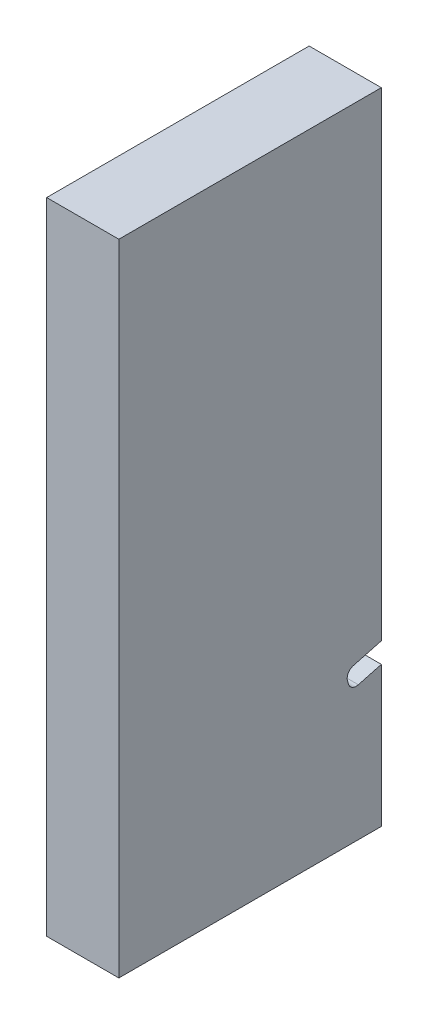
ISO-10303-21;
HEADER;
FILE_DESCRIPTION(('STEP AP214'),'2;1');
FILE_NAME('part.step','',(''),(''),'','','');
FILE_SCHEMA(('AUTOMOTIVE_DESIGN { 1 0 10303 214 1 1 1 1 }'));
ENDSEC;
DATA;
#1=APPLICATION_CONTEXT('core data for automotive mechanical design processes');
#2=APPLICATION_PROTOCOL_DEFINITION('international standard','automotive_design',2000,#1);
#3=PRODUCT_CONTEXT('',#1,'mechanical');
#4=PRODUCT('Part','Part','',(#3));
#5=PRODUCT_RELATED_PRODUCT_CATEGORY('part','',(#4));
#6=PRODUCT_DEFINITION_FORMATION('','',#4);
#7=PRODUCT_DEFINITION_CONTEXT('part definition',#1,'design');
#8=PRODUCT_DEFINITION('design','',#6,#7);
#9=PRODUCT_DEFINITION_SHAPE('','',#8);
#10=(LENGTH_UNIT() NAMED_UNIT(*) SI_UNIT(.MILLI.,.METRE.));
#11=(NAMED_UNIT(*) PLANE_ANGLE_UNIT() SI_UNIT($,.RADIAN.));
#12=(NAMED_UNIT(*) SI_UNIT($,.STERADIAN.) SOLID_ANGLE_UNIT());
#13=UNCERTAINTY_MEASURE_WITH_UNIT(LENGTH_MEASURE(1.E-05),#10,'distance_accuracy_value','');
#14=(GEOMETRIC_REPRESENTATION_CONTEXT(3) GLOBAL_UNCERTAINTY_ASSIGNED_CONTEXT((#13)) GLOBAL_UNIT_ASSIGNED_CONTEXT((#10,
#11,#12)) REPRESENTATION_CONTEXT('',''));
#15=CARTESIAN_POINT('',(0.,0.,0.));
#16=DIRECTION('',(0.,0.,1.));
#17=DIRECTION('',(1.,0.,0.));
#18=AXIS2_PLACEMENT_3D('',#15,#16,#17);
#19=CARTESIAN_POINT('',(0.01,70.,-615.01));
#20=DIRECTION('',(0.,-1.,0.));
#21=DIRECTION('',(0.,0.,1.));
#22=AXIS2_PLACEMENT_3D('',#19,#20,#21);
#23=PLANE('',#22);
#24=DIRECTION('',(0.,0.,1.));
#25=VECTOR('',#24,1.);
#26=CARTESIAN_POINT('',(-22.,70.,-575.));
#27=LINE('',#26,#25);
#28=CARTESIAN_POINT('',(-22.,70.,-615.));
#29=VERTEX_POINT('',#28);
#30=CARTESIAN_POINT('',(-22.,70.,-535.));
#31=VERTEX_POINT('',#30);
#32=EDGE_CURVE('E98',#29,#31,#27,.T.);
#33=ORIENTED_EDGE('',*,*,#32,.F.);
#34=DIRECTION('',(-1.,0.,0.));
#35=VECTOR('',#34,1.);
#36=CARTESIAN_POINT('',(-11.,70.,-615.));
#37=LINE('',#36,#35);
#38=CARTESIAN_POINT('',(0.,69.9999999999999,-615.));
#39=VERTEX_POINT('',#38);
#40=EDGE_CURVE('E109',#39,#29,#37,.T.);
#41=ORIENTED_EDGE('',*,*,#40,.F.);
#42=DIRECTION('',(0.,0.,-1.));
#43=VECTOR('',#42,1.);
#44=CARTESIAN_POINT('',(0.,69.9999999999999,-575.));
#45=LINE('',#44,#43);
#46=CARTESIAN_POINT('',(0.,69.9999999999999,-535.));
#47=VERTEX_POINT('',#46);
#48=EDGE_CURVE('E108',#47,#39,#45,.T.);
#49=ORIENTED_EDGE('',*,*,#48,.F.);
#50=DIRECTION('',(1.,0.,0.));
#51=VECTOR('',#50,1.);
#52=CARTESIAN_POINT('',(-11.,69.9999999999999,-535.));
#53=LINE('',#52,#51);
#54=EDGE_CURVE('E132',#31,#47,#53,.T.);
#55=ORIENTED_EDGE('',*,*,#54,.F.);
#56=EDGE_LOOP('',(#33,#41,#49,#55));
#57=FACE_BOUND('',#56,.T.);
#58=ADVANCED_FACE('F17',(#57),#23,.T.);
#59=CARTESIAN_POINT('',(0.01,69.9899999999999,-535.));
#60=DIRECTION('',(0.,0.,1.));
#61=DIRECTION('',(0.,1.,0.));
#62=AXIS2_PLACEMENT_3D('',#59,#60,#61);
#63=PLANE('',#62);
#64=DIRECTION('',(0.,1.,0.));
#65=VECTOR('',#64,1.);
#66=CARTESIAN_POINT('',(-22.,167.5,-535.));
#67=LINE('',#66,#65);
#68=CARTESIAN_POINT('',(-22.,265.,-535.));
#69=VERTEX_POINT('',#68);
#70=EDGE_CURVE('E127',#31,#69,#67,.T.);
#71=ORIENTED_EDGE('',*,*,#70,.F.);
#72=ORIENTED_EDGE('',*,*,#54,.T.);
#73=DIRECTION('',(0.,-1.,0.));
#74=VECTOR('',#73,1.);
#75=CARTESIAN_POINT('',(0.,167.5,-535.));
#76=LINE('',#75,#74);
#77=CARTESIAN_POINT('',(0.,265.,-535.));
#78=VERTEX_POINT('',#77);
#79=EDGE_CURVE('E165',#78,#47,#76,.T.);
#80=ORIENTED_EDGE('',*,*,#79,.F.);
#81=DIRECTION('',(1.,0.,0.));
#82=VECTOR('',#81,1.);
#83=CARTESIAN_POINT('',(-11.,265.,-535.));
#84=LINE('',#83,#82);
#85=EDGE_CURVE('E122',#69,#78,#84,.T.);
#86=ORIENTED_EDGE('',*,*,#85,.F.);
#87=EDGE_LOOP('',(#71,#72,#80,#86));
#88=FACE_BOUND('',#87,.T.);
#89=ADVANCED_FACE('F225',(#88),#63,.T.);
#90=CARTESIAN_POINT('',(0.01,265.,-534.99));
#91=DIRECTION('',(0.,1.,0.));
#92=DIRECTION('',(0.,0.,-1.));
#93=AXIS2_PLACEMENT_3D('',#90,#91,#92);
#94=PLANE('',#93);
#95=DIRECTION('',(0.,0.,-1.));
#96=VECTOR('',#95,1.);
#97=CARTESIAN_POINT('',(-22.,265.,-575.));
#98=LINE('',#97,#96);
#99=CARTESIAN_POINT('',(-22.,265.,-615.));
#100=VERTEX_POINT('',#99);
#101=EDGE_CURVE('E117',#69,#100,#98,.T.);
#102=ORIENTED_EDGE('',*,*,#101,.F.);
#103=ORIENTED_EDGE('',*,*,#85,.T.);
#104=DIRECTION('',(0.,0.,1.));
#105=VECTOR('',#104,1.);
#106=CARTESIAN_POINT('',(0.,265.,-575.));
#107=LINE('',#106,#105);
#108=CARTESIAN_POINT('',(0.,265.,-615.));
#109=VERTEX_POINT('',#108);
#110=EDGE_CURVE('E158',#109,#78,#107,.T.);
#111=ORIENTED_EDGE('',*,*,#110,.F.);
#112=DIRECTION('',(1.,0.,0.));
#113=VECTOR('',#112,1.);
#114=CARTESIAN_POINT('',(-11.,265.,-615.));
#115=LINE('',#114,#113);
#116=EDGE_CURVE('E112',#100,#109,#115,.T.);
#117=ORIENTED_EDGE('',*,*,#116,.F.);
#118=EDGE_LOOP('',(#102,#103,#111,#117));
#119=FACE_BOUND('',#118,.T.);
#120=ADVANCED_FACE('F228',(#119),#94,.T.);
#121=CARTESIAN_POINT('',(0.01,265.01,-615.));
#122=DIRECTION('',(0.,0.,-1.));
#123=DIRECTION('',(0.,-1.,0.));
#124=AXIS2_PLACEMENT_3D('',#121,#122,#123);
#125=PLANE('',#124);
#126=DIRECTION('',(0.,-1.,0.));
#127=VECTOR('',#126,1.);
#128=CARTESIAN_POINT('',(-22.,167.5,-615.));
#129=LINE('',#128,#127);
#130=CARTESIAN_POINT('',(-22.,119.,-615.));
#131=VERTEX_POINT('',#130);
#132=EDGE_CURVE('E113',#100,#131,#129,.T.);
#133=ORIENTED_EDGE('',*,*,#132,.F.);
#134=ORIENTED_EDGE('',*,*,#116,.T.);
#135=DIRECTION('',(0.,1.,0.));
#136=VECTOR('',#135,1.);
#137=CARTESIAN_POINT('',(0.,167.5,-615.));
#138=LINE('',#137,#136);
#139=CARTESIAN_POINT('',(0.,119.,-615.));
#140=VERTEX_POINT('',#139);
#141=EDGE_CURVE('E155',#140,#109,#138,.T.);
#142=ORIENTED_EDGE('',*,*,#141,.F.);
#143=DIRECTION('',(1.,0.,0.));
#144=VECTOR('',#143,1.);
#145=CARTESIAN_POINT('',(-11.,119.,-615.));
#146=LINE('',#145,#144);
#147=EDGE_CURVE('E110',#131,#140,#146,.T.);
#148=ORIENTED_EDGE('',*,*,#147,.F.);
#149=EDGE_LOOP('',(#133,#134,#142,#148));
#150=FACE_BOUND('',#149,.T.);
#151=ADVANCED_FACE('F231',(#150),#125,.T.);
#152=CARTESIAN_POINT('',(0.01,119.002588190451,-615.009659258263));
#153=DIRECTION('',(0.,-0.96592582628907,-0.258819045102515));
#154=DIRECTION('',(0.,-0.258819045102515,0.96592582628907));
#155=AXIS2_PLACEMENT_3D('',#152,#153,#154);
#156=PLANE('',#155);
#157=ORIENTED_EDGE('',*,*,#147,.T.);
#158=DIRECTION('',(0.,0.258819045102527,-0.965925826289067));
#159=VECTOR('',#158,1.);
#160=CARTESIAN_POINT('',(0.,116.708414566618,-606.447686732734));
#161=LINE('',#160,#159);
#162=CARTESIAN_POINT('',(0.,116.708414566618,-606.447686732734));
#163=VERTEX_POINT('',#162);
#164=EDGE_CURVE('E80',#163,#140,#161,.T.);
#165=ORIENTED_EDGE('',*,*,#164,.F.);
#166=DIRECTION('',(1.,0.,0.));
#167=VECTOR('',#166,1.);
#168=CARTESIAN_POINT('',(-11.,116.708414566618,-606.447686732734));
#169=LINE('',#168,#167);
#170=CARTESIAN_POINT('',(-22.,116.708414566618,-606.447686732734));
#171=VERTEX_POINT('',#170);
#172=EDGE_CURVE('E76',#171,#163,#169,.T.);
#173=ORIENTED_EDGE('',*,*,#172,.F.);
#174=DIRECTION('',(0.,-0.258819045102526,0.965925826289067));
#175=VECTOR('',#174,1.);
#176=CARTESIAN_POINT('',(-22.,119.,-615.));
#177=LINE('',#176,#175);
#178=EDGE_CURVE('E116',#131,#171,#177,.T.);
#179=ORIENTED_EDGE('',*,*,#178,.F.);
#180=EDGE_LOOP('',(#157,#165,#173,#179));
#181=FACE_BOUND('',#180,.T.);
#182=ADVANCED_FACE('F184',(#181),#156,.T.);
#183=CARTESIAN_POINT('',(0.01,112.798342917539,-615.));
#184=DIRECTION('',(0.,0.,-1.));
#185=DIRECTION('',(0.,-1.,0.));
#186=AXIS2_PLACEMENT_3D('',#183,#184,#185);
#187=PLANE('',#186);
#188=DIRECTION('',(0.,-1.,0.));
#189=VECTOR('',#188,1.);
#190=CARTESIAN_POINT('',(-22.,167.5,-615.));
#191=LINE('',#190,#189);
#192=CARTESIAN_POINT('',(-22.,112.788342917539,-615.));
#193=VERTEX_POINT('',#192);
#194=EDGE_CURVE('E92',#193,#29,#191,.T.);
#195=ORIENTED_EDGE('',*,*,#194,.F.);
#196=DIRECTION('',(-1.,0.,0.));
#197=VECTOR('',#196,1.);
#198=CARTESIAN_POINT('',(-11.,112.788342917539,-615.));
#199=LINE('',#198,#197);
#200=CARTESIAN_POINT('',(0.,112.788342917539,-615.));
#201=VERTEX_POINT('',#200);
#202=EDGE_CURVE('E96',#201,#193,#199,.T.);
#203=ORIENTED_EDGE('',*,*,#202,.F.);
#204=DIRECTION('',(0.,1.,0.));
#205=VECTOR('',#204,1.);
#206=CARTESIAN_POINT('',(0.,167.5,-615.));
#207=LINE('',#206,#205);
#208=EDGE_CURVE('E81',#39,#201,#207,.T.);
#209=ORIENTED_EDGE('',*,*,#208,.F.);
#210=ORIENTED_EDGE('',*,*,#40,.T.);
#211=EDGE_LOOP('',(#195,#203,#209,#210));
#212=FACE_BOUND('',#211,.T.);
#213=ADVANCED_FACE('F216',(#212),#187,.T.);
#214=CARTESIAN_POINT('',(0.,114.293600000895,-607.09473434549));
#215=DIRECTION('',(-1.,0.,0.));
#216=DIRECTION('',(0.,0.,1.));
#217=AXIS2_PLACEMENT_3D('',#214,#215,#216);
#218=CYLINDRICAL_SURFACE('',#217,2.49999999999991);
#219=CARTESIAN_POINT('',(-22.,114.293600000895,-607.09473434549));
#220=DIRECTION('',(-1.,0.,0.));
#221=DIRECTION('',(0.,0.,1.));
#222=AXIS2_PLACEMENT_3D('',#219,#220,#221);
#223=CIRCLE('',#222,2.49999999999991);
#224=CARTESIAN_POINT('',(-22.,113.646552388139,-604.679919779768));
#225=VERTEX_POINT('',#224);
#226=EDGE_CURVE('E179',#171,#225,#223,.F.);
#227=ORIENTED_EDGE('',*,*,#226,.F.);
#228=ORIENTED_EDGE('',*,*,#172,.T.);
#229=CARTESIAN_POINT('',(0.,114.293600000895,-607.09473434549));
#230=DIRECTION('',(-1.,0.,0.));
#231=DIRECTION('',(0.,0.,1.));
#232=AXIS2_PLACEMENT_3D('',#229,#230,#231);
#233=CIRCLE('',#232,2.49999999999991);
#234=CARTESIAN_POINT('',(0.,113.646552388139,-604.679919779768));
#235=VERTEX_POINT('',#234);
#236=EDGE_CURVE('E21',#235,#163,#233,.T.);
#237=ORIENTED_EDGE('',*,*,#236,.F.);
#238=DIRECTION('',(1.,0.,0.));
#239=VECTOR('',#238,1.);
#240=CARTESIAN_POINT('',(-11.,113.646552388139,-604.679919779768));
#241=LINE('',#240,#239);
#242=EDGE_CURVE('E75',#225,#235,#241,.T.);
#243=ORIENTED_EDGE('',*,*,#242,.F.);
#244=EDGE_LOOP('',(#227,#228,#237,#243));
#245=FACE_BOUND('',#244,.T.);
#246=ADVANCED_FACE('F73',(#245),#218,.F.);
#247=CARTESIAN_POINT('',(0.,69.9899999999999,-534.99));
#248=DIRECTION('',(1.,0.,0.));
#249=DIRECTION('',(0.,0.,-1.));
#250=AXIS2_PLACEMENT_3D('',#247,#248,#249);
#251=PLANE('',#250);
#252=ORIENTED_EDGE('',*,*,#110,.T.);
#253=ORIENTED_EDGE('',*,*,#79,.T.);
#254=ORIENTED_EDGE('',*,*,#48,.T.);
#255=ORIENTED_EDGE('',*,*,#208,.T.);
#256=DIRECTION('',(0.,0.258819045102561,-0.965925826289058));
#257=VECTOR('',#256,1.);
#258=CARTESIAN_POINT('',(0.,111.850601263211,-611.500300501675));
#259=LINE('',#258,#257);
#260=CARTESIAN_POINT('',(0.,110.912859608883,-608.00060100335));
#261=VERTEX_POINT('',#260);
#262=EDGE_CURVE('E99',#261,#201,#259,.T.);
#263=ORIENTED_EDGE('',*,*,#262,.F.);
#264=CARTESIAN_POINT('',(0.,113.327674174606,-607.353553390594));
#265=DIRECTION('',(-1.,0.,0.));
#266=DIRECTION('',(0.,0.,1.));
#267=AXIS2_PLACEMENT_3D('',#264,#265,#266);
#268=CIRCLE('',#267,2.50000000000026);
#269=CARTESIAN_POINT('',(0.,112.68062656185,-604.938738824871));
#270=VERTEX_POINT('',#269);
#271=EDGE_CURVE('E87',#270,#261,#268,.F.);
#272=ORIENTED_EDGE('',*,*,#271,.F.);
#273=DIRECTION('',(0.,-0.965925826289063,-0.258819045102539));
#274=VECTOR('',#273,1.);
#275=CARTESIAN_POINT('',(0.,113.163589474994,-604.80932930232));
#276=LINE('',#275,#274);
#277=EDGE_CURVE('E83',#235,#270,#276,.T.);
#278=ORIENTED_EDGE('',*,*,#277,.F.);
#279=ORIENTED_EDGE('',*,*,#236,.T.);
#280=ORIENTED_EDGE('',*,*,#164,.T.);
#281=ORIENTED_EDGE('',*,*,#141,.T.);
#282=EDGE_LOOP('',(#252,#253,#254,#255,#263,#272,#278,#279,#280,#281));
#283=FACE_BOUND('',#282,.T.);
#284=ADVANCED_FACE('F85',(#283),#251,.T.);
#285=CARTESIAN_POINT('',(0.0100000000000011,110.910271418432,-607.990941745087));
#286=DIRECTION('',(0.,0.965925826289058,0.258819045102561));
#287=DIRECTION('',(0.,0.258819045102561,-0.965925826289058));
#288=AXIS2_PLACEMENT_3D('',#285,#286,#287);
#289=PLANE('',#288);
#290=ORIENTED_EDGE('',*,*,#202,.T.);
#291=DIRECTION('',(0.,0.258819045102569,-0.965925826289055));
#292=VECTOR('',#291,1.);
#293=CARTESIAN_POINT('',(-22.,110.912859608883,-608.00060100335));
#294=LINE('',#293,#292);
#295=CARTESIAN_POINT('',(-22.,110.912859608883,-608.00060100335));
#296=VERTEX_POINT('',#295);
#297=EDGE_CURVE('E104',#296,#193,#294,.T.);
#298=ORIENTED_EDGE('',*,*,#297,.F.);
#299=DIRECTION('',(-1.,0.,0.));
#300=VECTOR('',#299,1.);
#301=CARTESIAN_POINT('',(-11.,110.912859608883,-608.00060100335));
#302=LINE('',#301,#300);
#303=EDGE_CURVE('E175',#261,#296,#302,.T.);
#304=ORIENTED_EDGE('',*,*,#303,.F.);
#305=ORIENTED_EDGE('',*,*,#262,.T.);
#306=EDGE_LOOP('',(#290,#298,#304,#305));
#307=FACE_BOUND('',#306,.T.);
#308=ADVANCED_FACE('F218',(#307),#289,.T.);
#309=CARTESIAN_POINT('',(-22.,69.9899999999999,-615.01));
#310=DIRECTION('',(-1.,0.,0.));
#311=DIRECTION('',(0.,0.,1.));
#312=AXIS2_PLACEMENT_3D('',#309,#310,#311);
#313=PLANE('',#312);
#314=ORIENTED_EDGE('',*,*,#297,.T.);
#315=ORIENTED_EDGE('',*,*,#194,.T.);
#316=ORIENTED_EDGE('',*,*,#32,.T.);
#317=ORIENTED_EDGE('',*,*,#70,.T.);
#318=ORIENTED_EDGE('',*,*,#101,.T.);
#319=ORIENTED_EDGE('',*,*,#132,.T.);
#320=ORIENTED_EDGE('',*,*,#178,.T.);
#321=ORIENTED_EDGE('',*,*,#226,.T.);
#322=DIRECTION('',(0.,0.965925826289063,0.258819045102539));
#323=VECTOR('',#322,1.);
#324=CARTESIAN_POINT('',(-22.,113.163589474994,-604.80932930232));
#325=LINE('',#324,#323);
#326=CARTESIAN_POINT('',(-22.,112.68062656185,-604.938738824871));
#327=VERTEX_POINT('',#326);
#328=EDGE_CURVE('E36',#327,#225,#325,.T.);
#329=ORIENTED_EDGE('',*,*,#328,.F.);
#330=CARTESIAN_POINT('',(-22.,113.327674174606,-607.353553390594));
#331=DIRECTION('',(-1.,0.,0.));
#332=DIRECTION('',(0.,0.,1.));
#333=AXIS2_PLACEMENT_3D('',#330,#331,#332);
#334=CIRCLE('',#333,2.50000000000026);
#335=EDGE_CURVE('E27',#296,#327,#334,.T.);
#336=ORIENTED_EDGE('',*,*,#335,.F.);
#337=EDGE_LOOP('',(#314,#315,#316,#317,#318,#319,#320,#321,#329,#336));
#338=FACE_BOUND('',#337,.T.);
#339=ADVANCED_FACE('F224',(#338),#313,.T.);
#340=CARTESIAN_POINT('',(0.0100000000000022,113.656211646402,-604.677331589317));
#341=DIRECTION('',(0.,0.258819045102539,-0.965925826289063));
#342=DIRECTION('',(0.,-0.965925826289063,-0.258819045102539));
#343=AXIS2_PLACEMENT_3D('',#340,#341,#342);
#344=PLANE('',#343);
#345=ORIENTED_EDGE('',*,*,#242,.T.);
#346=ORIENTED_EDGE('',*,*,#277,.T.);
#347=DIRECTION('',(1.,0.,0.));
#348=VECTOR('',#347,1.);
#349=CARTESIAN_POINT('',(-11.,112.68062656185,-604.938738824871));
#350=LINE('',#349,#348);
#351=EDGE_CURVE('E11',#327,#270,#350,.T.);
#352=ORIENTED_EDGE('',*,*,#351,.F.);
#353=ORIENTED_EDGE('',*,*,#328,.T.);
#354=EDGE_LOOP('',(#345,#346,#352,#353));
#355=FACE_BOUND('',#354,.T.);
#356=ADVANCED_FACE('F90',(#355),#344,.T.);
#357=CARTESIAN_POINT('',(0.,113.327674174606,-607.353553390594));
#358=DIRECTION('',(-1.,0.,0.));
#359=DIRECTION('',(0.,0.,1.));
#360=AXIS2_PLACEMENT_3D('',#357,#358,#359);
#361=CYLINDRICAL_SURFACE('',#360,2.50000000000026);
#362=ORIENTED_EDGE('',*,*,#335,.T.);
#363=ORIENTED_EDGE('',*,*,#351,.T.);
#364=ORIENTED_EDGE('',*,*,#271,.T.);
#365=ORIENTED_EDGE('',*,*,#303,.T.);
#366=EDGE_LOOP('',(#362,#363,#364,#365));
#367=FACE_BOUND('',#366,.T.);
#368=ADVANCED_FACE('F19',(#367),#361,.F.);
#369=CLOSED_SHELL('',(#58,#89,#120,#151,#182,#213,#246,#284,#308,#339,#356,#368));
#370=MANIFOLD_SOLID_BREP('B1',#369);
#371=ADVANCED_BREP_SHAPE_REPRESENTATION('',(#18,#370),#14);
#372=SHAPE_DEFINITION_REPRESENTATION(#9,#371);
ENDSEC;
END-ISO-10303-21;
